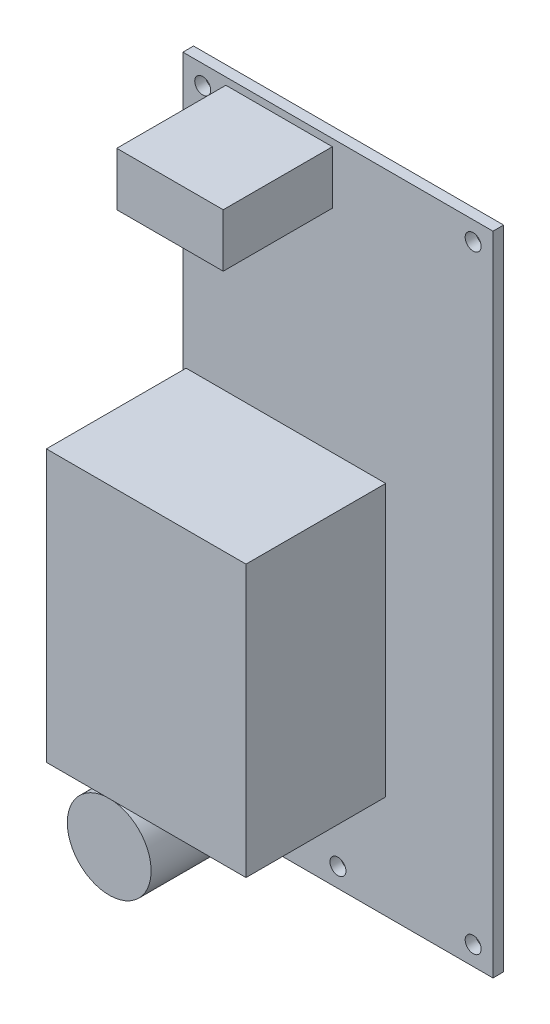
ISO-10303-21;
HEADER;
FILE_DESCRIPTION(('STEP AP214'),'2;1');
FILE_NAME('part.step','',(''),(''),'','','');
FILE_SCHEMA(('AUTOMOTIVE_DESIGN { 1 0 10303 214 1 1 1 1 }'));
ENDSEC;
DATA;
#1=APPLICATION_CONTEXT('core data for automotive mechanical design processes');
#2=APPLICATION_PROTOCOL_DEFINITION('international standard','automotive_design',2000,#1);
#3=PRODUCT_CONTEXT('',#1,'mechanical');
#4=PRODUCT('Part','Part','',(#3));
#5=PRODUCT_RELATED_PRODUCT_CATEGORY('part','',(#4));
#6=PRODUCT_DEFINITION_FORMATION('','',#4);
#7=PRODUCT_DEFINITION_CONTEXT('part definition',#1,'design');
#8=PRODUCT_DEFINITION('design','',#6,#7);
#9=PRODUCT_DEFINITION_SHAPE('','',#8);
#10=(LENGTH_UNIT() NAMED_UNIT(*) SI_UNIT(.MILLI.,.METRE.));
#11=(NAMED_UNIT(*) PLANE_ANGLE_UNIT() SI_UNIT($,.RADIAN.));
#12=(NAMED_UNIT(*) SI_UNIT($,.STERADIAN.) SOLID_ANGLE_UNIT());
#13=UNCERTAINTY_MEASURE_WITH_UNIT(LENGTH_MEASURE(1.E-05),#10,'distance_accuracy_value','');
#14=(GEOMETRIC_REPRESENTATION_CONTEXT(3) GLOBAL_UNCERTAINTY_ASSIGNED_CONTEXT((#13)) GLOBAL_UNIT_ASSIGNED_CONTEXT((#10,
#11,#12)) REPRESENTATION_CONTEXT('',''));
#15=CARTESIAN_POINT('',(0.,0.,0.));
#16=DIRECTION('',(0.,0.,1.));
#17=DIRECTION('',(1.,0.,0.));
#18=AXIS2_PLACEMENT_3D('',#15,#16,#17);
#19=CARTESIAN_POINT('',(466.15195568,440.71997454,-0.8));
#20=DIRECTION('',(0.,0.,1.));
#21=DIRECTION('',(1.,0.,0.));
#22=AXIS2_PLACEMENT_3D('',#19,#20,#21);
#23=CYLINDRICAL_SURFACE('',#22,0.600798900000032);
#24=CARTESIAN_POINT('',(466.15195568,440.71997454,0.));
#25=DIRECTION('',(0.,0.,-1.));
#26=DIRECTION('',(1.,0.,0.));
#27=AXIS2_PLACEMENT_3D('',#24,#25,#26);
#28=CIRCLE('',#27,0.600798900000032);
#29=CARTESIAN_POINT('',(466.75275458,440.71997454,0.));
#30=VERTEX_POINT('',#29);
#31=EDGE_CURVE('E180',#30,#30,#28,.T.);
#32=ORIENTED_EDGE('',*,*,#31,.F.);
#33=EDGE_LOOP('',(#32));
#34=FACE_BOUND('',#33,.T.);
#35=CARTESIAN_POINT('',(466.15195568,440.71997454,-0.8));
#36=DIRECTION('',(0.,0.,1.));
#37=DIRECTION('',(1.,0.,0.));
#38=AXIS2_PLACEMENT_3D('',#35,#36,#37);
#39=CIRCLE('',#38,0.600798900000032);
#40=CARTESIAN_POINT('',(466.75275458,440.71997454,-0.8));
#41=VERTEX_POINT('',#40);
#42=EDGE_CURVE('E195',#41,#41,#39,.T.);
#43=ORIENTED_EDGE('',*,*,#42,.F.);
#44=EDGE_LOOP('',(#43));
#45=FACE_BOUND('',#44,.T.);
#46=ADVANCED_FACE('F15',(#34,#45),#23,.F.);
#47=CARTESIAN_POINT('',(476.31195568,440.71997454,-0.8));
#48=DIRECTION('',(0.,0.,1.));
#49=DIRECTION('',(1.,0.,0.));
#50=AXIS2_PLACEMENT_3D('',#47,#48,#49);
#51=CYLINDRICAL_SURFACE('',#50,0.600798899999977);
#52=CARTESIAN_POINT('',(476.31195568,440.71997454,0.));
#53=DIRECTION('',(0.,0.,-1.));
#54=DIRECTION('',(1.,0.,0.));
#55=AXIS2_PLACEMENT_3D('',#52,#53,#54);
#56=CIRCLE('',#55,0.600798899999977);
#57=CARTESIAN_POINT('',(476.91275458,440.71997454,0.));
#58=VERTEX_POINT('',#57);
#59=EDGE_CURVE('E186',#58,#58,#56,.T.);
#60=ORIENTED_EDGE('',*,*,#59,.F.);
#61=EDGE_LOOP('',(#60));
#62=FACE_BOUND('',#61,.T.);
#63=CARTESIAN_POINT('',(476.31195568,440.71997454,-0.8));
#64=DIRECTION('',(0.,0.,1.));
#65=DIRECTION('',(1.,0.,0.));
#66=AXIS2_PLACEMENT_3D('',#63,#64,#65);
#67=CIRCLE('',#66,0.600798899999977);
#68=CARTESIAN_POINT('',(476.91275458,440.71997454,-0.8));
#69=VERTEX_POINT('',#68);
#70=EDGE_CURVE('E196',#69,#69,#67,.T.);
#71=ORIENTED_EDGE('',*,*,#70,.F.);
#72=EDGE_LOOP('',(#71));
#73=FACE_BOUND('',#72,.T.);
#74=ADVANCED_FACE('F270',(#62,#73),#51,.F.);
#75=CARTESIAN_POINT('',(476.31195568,486.43997454,-0.8));
#76=DIRECTION('',(0.,0.,1.));
#77=DIRECTION('',(1.,0.,0.));
#78=AXIS2_PLACEMENT_3D('',#75,#76,#77);
#79=CYLINDRICAL_SURFACE('',#78,0.600798899999977);
#80=CARTESIAN_POINT('',(476.31195568,486.43997454,0.));
#81=DIRECTION('',(0.,0.,-1.));
#82=DIRECTION('',(1.,0.,0.));
#83=AXIS2_PLACEMENT_3D('',#80,#81,#82);
#84=CIRCLE('',#83,0.600798899999977);
#85=CARTESIAN_POINT('',(476.91275458,486.43997454,0.));
#86=VERTEX_POINT('',#85);
#87=EDGE_CURVE('E191',#86,#86,#84,.T.);
#88=ORIENTED_EDGE('',*,*,#87,.F.);
#89=EDGE_LOOP('',(#88));
#90=FACE_BOUND('',#89,.T.);
#91=CARTESIAN_POINT('',(476.31195568,486.43997454,-0.8));
#92=DIRECTION('',(0.,0.,1.));
#93=DIRECTION('',(1.,0.,0.));
#94=AXIS2_PLACEMENT_3D('',#91,#92,#93);
#95=CIRCLE('',#94,0.600798899999977);
#96=CARTESIAN_POINT('',(476.91275458,486.43997454,-0.8));
#97=VERTEX_POINT('',#96);
#98=EDGE_CURVE('E198',#97,#97,#95,.T.);
#99=ORIENTED_EDGE('',*,*,#98,.F.);
#100=EDGE_LOOP('',(#99));
#101=FACE_BOUND('',#100,.T.);
#102=ADVANCED_FACE('F278',(#90,#101),#79,.F.);
#103=CARTESIAN_POINT('',(455.99195568,486.43997454,-0.8));
#104=DIRECTION('',(0.,0.,1.));
#105=DIRECTION('',(1.,0.,0.));
#106=AXIS2_PLACEMENT_3D('',#103,#104,#105);
#107=CYLINDRICAL_SURFACE('',#106,0.600798899999977);
#108=CARTESIAN_POINT('',(455.99195568,486.43997454,0.));
#109=DIRECTION('',(0.,0.,-1.));
#110=DIRECTION('',(1.,0.,0.));
#111=AXIS2_PLACEMENT_3D('',#108,#109,#110);
#112=CIRCLE('',#111,0.600798899999977);
#113=CARTESIAN_POINT('',(456.59275458,486.43997454,0.));
#114=VERTEX_POINT('',#113);
#115=EDGE_CURVE('E205',#114,#114,#112,.T.);
#116=ORIENTED_EDGE('',*,*,#115,.F.);
#117=EDGE_LOOP('',(#116));
#118=FACE_BOUND('',#117,.T.);
#119=CARTESIAN_POINT('',(455.99195568,486.43997454,-0.8));
#120=DIRECTION('',(0.,0.,1.));
#121=DIRECTION('',(1.,0.,0.));
#122=AXIS2_PLACEMENT_3D('',#119,#120,#121);
#123=CIRCLE('',#122,0.600798899999977);
#124=CARTESIAN_POINT('',(456.59275458,486.43997454,-0.8));
#125=VERTEX_POINT('',#124);
#126=EDGE_CURVE('E202',#125,#125,#123,.T.);
#127=ORIENTED_EDGE('',*,*,#126,.F.);
#128=EDGE_LOOP('',(#127));
#129=FACE_BOUND('',#128,.T.);
#130=ADVANCED_FACE('F285',(#118,#129),#107,.F.);
#131=CARTESIAN_POINT('',(458.4659614,442.9019844,9.5));
#132=DIRECTION('',(0.,0.,-1.));
#133=DIRECTION('',(-1.,0.,0.));
#134=AXIS2_PLACEMENT_3D('',#131,#132,#133);
#135=CYLINDRICAL_SURFACE('',#134,3.15000640000002);
#136=CARTESIAN_POINT('',(458.4659614,442.9019844,0.));
#137=DIRECTION('',(0.,0.,1.));
#138=DIRECTION('',(-1.,0.,0.));
#139=AXIS2_PLACEMENT_3D('',#136,#137,#138);
#140=CIRCLE('',#139,3.15000640000002);
#141=CARTESIAN_POINT('',(455.315955,442.9019844,0.));
#142=VERTEX_POINT('',#141);
#143=EDGE_CURVE('E25',#142,#142,#140,.T.);
#144=ORIENTED_EDGE('',*,*,#143,.T.);
#145=EDGE_LOOP('',(#144));
#146=FACE_BOUND('',#145,.T.);
#147=CARTESIAN_POINT('',(458.4659614,442.9019844,9.5));
#148=DIRECTION('',(0.,0.,-1.));
#149=DIRECTION('',(-1.,0.,0.));
#150=AXIS2_PLACEMENT_3D('',#147,#148,#149);
#151=CIRCLE('',#150,3.15000640000002);
#152=CARTESIAN_POINT('',(455.315955,442.9019844,9.5));
#153=VERTEX_POINT('',#152);
#154=EDGE_CURVE('E10',#153,#153,#151,.T.);
#155=ORIENTED_EDGE('',*,*,#154,.T.);
#156=EDGE_LOOP('',(#155));
#157=FACE_BOUND('',#156,.T.);
#158=ADVANCED_FACE('F289',(#146,#157),#135,.T.);
#159=CARTESIAN_POINT('',(454.4019614,439.2321742,-0.8));
#160=DIRECTION('',(0.,0.,-1.));
#161=DIRECTION('',(-1.,0.,0.));
#162=AXIS2_PLACEMENT_3D('',#159,#160,#161);
#163=PLANE('',#162);
#164=DIRECTION('',(1.,0.,0.));
#165=VECTOR('',#164,1.);
#166=CARTESIAN_POINT('',(454.4019614,487.8799742,-0.8));
#167=LINE('',#166,#165);
#168=CARTESIAN_POINT('',(454.5019614,487.8799742,-0.800000000000002));
#169=VERTEX_POINT('',#168);
#170=CARTESIAN_POINT('',(477.80196266,487.8799742,-0.800000000000002));
#171=VERTEX_POINT('',#170);
#172=EDGE_CURVE('E214',#169,#171,#167,.T.);
#173=ORIENTED_EDGE('',*,*,#172,.T.);
#174=DIRECTION('',(0.,-1.,0.));
#175=VECTOR('',#174,1.);
#176=CARTESIAN_POINT('',(477.80196266,439.2321742,-0.8));
#177=LINE('',#176,#175);
#178=CARTESIAN_POINT('',(477.80196266,439.2821742,-0.800000000000002));
#179=VERTEX_POINT('',#178);
#180=EDGE_CURVE('E34',#171,#179,#177,.T.);
#181=ORIENTED_EDGE('',*,*,#180,.T.);
#182=DIRECTION('',(-1.,0.,0.));
#183=VECTOR('',#182,1.);
#184=CARTESIAN_POINT('',(454.4019614,439.2821742,-0.8));
#185=LINE('',#184,#183);
#186=CARTESIAN_POINT('',(454.5019614,439.2821742,-0.800000000000002));
#187=VERTEX_POINT('',#186);
#188=EDGE_CURVE('E217',#179,#187,#185,.T.);
#189=ORIENTED_EDGE('',*,*,#188,.T.);
#190=DIRECTION('',(0.,1.,0.));
#191=VECTOR('',#190,1.);
#192=CARTESIAN_POINT('',(454.5019614,439.2321742,-0.8));
#193=LINE('',#192,#191);
#194=EDGE_CURVE('E220',#187,#169,#193,.T.);
#195=ORIENTED_EDGE('',*,*,#194,.T.);
#196=EDGE_LOOP('',(#173,#181,#189,#195));
#197=FACE_BOUND('',#196,.T.);
#198=ORIENTED_EDGE('',*,*,#42,.T.);
#199=EDGE_LOOP('',(#198));
#200=FACE_BOUND('',#199,.T.);
#201=ORIENTED_EDGE('',*,*,#70,.T.);
#202=EDGE_LOOP('',(#201));
#203=FACE_BOUND('',#202,.T.);
#204=ORIENTED_EDGE('',*,*,#98,.T.);
#205=EDGE_LOOP('',(#204));
#206=FACE_BOUND('',#205,.T.);
#207=ORIENTED_EDGE('',*,*,#126,.T.);
#208=EDGE_LOOP('',(#207));
#209=FACE_BOUND('',#208,.T.);
#210=ADVANCED_FACE('F253',(#197,#200,#203,#206,#209),#163,.T.);
#211=CARTESIAN_POINT('',(477.80196266,487.8799742,48.5978257213221));
#212=DIRECTION('',(1.,0.,0.));
#213=DIRECTION('',(0.,0.,-1.));
#214=AXIS2_PLACEMENT_3D('',#211,#212,#213);
#215=PLANE('',#214);
#216=ORIENTED_EDGE('',*,*,#180,.F.);
#217=DIRECTION('',(0.,0.,1.));
#218=VECTOR('',#217,1.);
#219=CARTESIAN_POINT('',(477.80196266,487.8799742,48.5978257213221));
#220=LINE('',#219,#218);
#221=CARTESIAN_POINT('',(477.80196266,487.8799742,0.));
#222=VERTEX_POINT('',#221);
#223=EDGE_CURVE('E208',#171,#222,#220,.T.);
#224=ORIENTED_EDGE('',*,*,#223,.T.);
#225=DIRECTION('',(0.,-1.,0.));
#226=VECTOR('',#225,1.);
#227=CARTESIAN_POINT('',(477.80196266,487.8799742,0.));
#228=LINE('',#227,#226);
#229=CARTESIAN_POINT('',(477.80196266,439.2821742,0.));
#230=VERTEX_POINT('',#229);
#231=EDGE_CURVE('E224',#222,#230,#228,.T.);
#232=ORIENTED_EDGE('',*,*,#231,.T.);
#233=DIRECTION('',(0.,0.,-1.));
#234=VECTOR('',#233,1.);
#235=CARTESIAN_POINT('',(477.80196266,439.2821742,48.5978257213221));
#236=LINE('',#235,#234);
#237=EDGE_CURVE('E227',#230,#179,#236,.T.);
#238=ORIENTED_EDGE('',*,*,#237,.T.);
#239=EDGE_LOOP('',(#216,#224,#232,#238));
#240=FACE_BOUND('',#239,.T.);
#241=ADVANCED_FACE('F256',(#240),#215,.T.);
#242=CARTESIAN_POINT('',(454.5519614,487.8799742,53.851520157782));
#243=DIRECTION('',(0.,1.,0.));
#244=DIRECTION('',(0.,0.,1.));
#245=AXIS2_PLACEMENT_3D('',#242,#243,#244);
#246=PLANE('',#245);
#247=ORIENTED_EDGE('',*,*,#172,.F.);
#248=DIRECTION('',(0.,0.,1.));
#249=VECTOR('',#248,1.);
#250=CARTESIAN_POINT('',(454.5019614,487.8799742,53.851520157782));
#251=LINE('',#250,#249);
#252=CARTESIAN_POINT('',(454.5019614,487.8799742,0.));
#253=VERTEX_POINT('',#252);
#254=EDGE_CURVE('E229',#169,#253,#251,.T.);
#255=ORIENTED_EDGE('',*,*,#254,.T.);
#256=DIRECTION('',(1.,0.,0.));
#257=VECTOR('',#256,1.);
#258=CARTESIAN_POINT('',(454.5519614,487.8799742,0.));
#259=LINE('',#258,#257);
#260=EDGE_CURVE('E232',#253,#222,#259,.T.);
#261=ORIENTED_EDGE('',*,*,#260,.T.);
#262=ORIENTED_EDGE('',*,*,#223,.F.);
#263=EDGE_LOOP('',(#247,#255,#261,#262));
#264=FACE_BOUND('',#263,.T.);
#265=ADVANCED_FACE('F258',(#264),#246,.T.);
#266=CARTESIAN_POINT('',(454.5019614,487.8799742,48.5978257213221));
#267=DIRECTION('',(-1.,0.,0.));
#268=DIRECTION('',(0.,0.,1.));
#269=AXIS2_PLACEMENT_3D('',#266,#267,#268);
#270=PLANE('',#269);
#271=ORIENTED_EDGE('',*,*,#194,.F.);
#272=DIRECTION('',(0.,0.,1.));
#273=VECTOR('',#272,1.);
#274=CARTESIAN_POINT('',(454.5019614,439.2821742,48.5978257213221));
#275=LINE('',#274,#273);
#276=CARTESIAN_POINT('',(454.5019614,439.2821742,0.));
#277=VERTEX_POINT('',#276);
#278=EDGE_CURVE('E235',#187,#277,#275,.T.);
#279=ORIENTED_EDGE('',*,*,#278,.T.);
#280=DIRECTION('',(0.,1.,0.));
#281=VECTOR('',#280,1.);
#282=CARTESIAN_POINT('',(454.5019614,487.8799742,0.));
#283=LINE('',#282,#281);
#284=EDGE_CURVE('E238',#277,#253,#283,.T.);
#285=ORIENTED_EDGE('',*,*,#284,.T.);
#286=ORIENTED_EDGE('',*,*,#254,.F.);
#287=EDGE_LOOP('',(#271,#279,#285,#286));
#288=FACE_BOUND('',#287,.T.);
#289=ADVANCED_FACE('F250',(#288),#270,.T.);
#290=CARTESIAN_POINT('',(477.75196266,439.2821742,53.851520157782));
#291=DIRECTION('',(0.,-1.,0.));
#292=DIRECTION('',(0.,0.,-1.));
#293=AXIS2_PLACEMENT_3D('',#290,#291,#292);
#294=PLANE('',#293);
#295=ORIENTED_EDGE('',*,*,#188,.F.);
#296=ORIENTED_EDGE('',*,*,#237,.F.);
#297=DIRECTION('',(-1.,0.,0.));
#298=VECTOR('',#297,1.);
#299=CARTESIAN_POINT('',(477.75196266,439.2821742,0.));
#300=LINE('',#299,#298);
#301=EDGE_CURVE('E210',#230,#277,#300,.T.);
#302=ORIENTED_EDGE('',*,*,#301,.T.);
#303=ORIENTED_EDGE('',*,*,#278,.F.);
#304=EDGE_LOOP('',(#295,#296,#302,#303));
#305=FACE_BOUND('',#304,.T.);
#306=ADVANCED_FACE('F244',(#305),#294,.T.);
#307=CARTESIAN_POINT('',(454.4019614,439.2321742,0.));
#308=DIRECTION('',(0.,0.,-1.));
#309=DIRECTION('',(-1.,0.,0.));
#310=AXIS2_PLACEMENT_3D('',#307,#308,#309);
#311=PLANE('',#310);
#312=ORIENTED_EDGE('',*,*,#284,.F.);
#313=ORIENTED_EDGE('',*,*,#301,.F.);
#314=ORIENTED_EDGE('',*,*,#231,.F.);
#315=ORIENTED_EDGE('',*,*,#260,.F.);
#316=EDGE_LOOP('',(#312,#313,#314,#315));
#317=FACE_BOUND('',#316,.T.);
#318=ORIENTED_EDGE('',*,*,#115,.T.);
#319=EDGE_LOOP('',(#318));
#320=FACE_BOUND('',#319,.T.);
#321=ORIENTED_EDGE('',*,*,#87,.T.);
#322=EDGE_LOOP('',(#321));
#323=FACE_BOUND('',#322,.T.);
#324=ORIENTED_EDGE('',*,*,#59,.T.);
#325=EDGE_LOOP('',(#324));
#326=FACE_BOUND('',#325,.T.);
#327=ORIENTED_EDGE('',*,*,#31,.T.);
#328=EDGE_LOOP('',(#327));
#329=FACE_BOUND('',#328,.T.);
#330=ORIENTED_EDGE('',*,*,#143,.F.);
#331=EDGE_LOOP('',(#330));
#332=FACE_BOUND('',#331,.T.);
#333=DIRECTION('',(-1.,0.,0.));
#334=VECTOR('',#333,1.);
#335=CARTESIAN_POINT('',(454.4019614,487.3399702,0.));
#336=LINE('',#335,#334);
#337=CARTESIAN_POINT('',(465.7319616,487.3399702,0.));
#338=VERTEX_POINT('',#337);
#339=CARTESIAN_POINT('',(457.7319776,487.3399702,0.));
#340=VERTEX_POINT('',#339);
#341=EDGE_CURVE('E159',#338,#340,#336,.T.);
#342=ORIENTED_EDGE('',*,*,#341,.F.);
#343=DIRECTION('',(0.,1.,0.));
#344=VECTOR('',#343,1.);
#345=CARTESIAN_POINT('',(465.7319616,439.2321742,0.));
#346=LINE('',#345,#344);
#347=CARTESIAN_POINT('',(465.7319616,483.3399782,0.));
#348=VERTEX_POINT('',#347);
#349=EDGE_CURVE('E165',#348,#338,#346,.T.);
#350=ORIENTED_EDGE('',*,*,#349,.F.);
#351=DIRECTION('',(1.,0.,0.));
#352=VECTOR('',#351,1.);
#353=CARTESIAN_POINT('',(454.4019614,483.3399782,0.));
#354=LINE('',#353,#352);
#355=CARTESIAN_POINT('',(457.7319776,483.3399782,0.));
#356=VERTEX_POINT('',#355);
#357=EDGE_CURVE('E148',#356,#348,#354,.T.);
#358=ORIENTED_EDGE('',*,*,#357,.F.);
#359=DIRECTION('',(0.,-1.,0.));
#360=VECTOR('',#359,1.);
#361=CARTESIAN_POINT('',(457.7319776,439.2321742,0.));
#362=LINE('',#361,#360);
#363=EDGE_CURVE('E158',#340,#356,#362,.T.);
#364=ORIENTED_EDGE('',*,*,#363,.F.);
#365=EDGE_LOOP('',(#342,#350,#358,#364));
#366=FACE_BOUND('',#365,.T.);
#367=DIRECTION('',(1.,0.,0.));
#368=VECTOR('',#367,1.);
#369=CARTESIAN_POINT('',(454.4019614,447.0359614,0.));
#370=LINE('',#369,#368);
#371=CARTESIAN_POINT('',(454.7429818,447.0359614,0.));
#372=VERTEX_POINT('',#371);
#373=CARTESIAN_POINT('',(469.7429772,447.0359614,0.));
#374=VERTEX_POINT('',#373);
#375=EDGE_CURVE('E137',#372,#374,#370,.T.);
#376=ORIENTED_EDGE('',*,*,#375,.F.);
#377=DIRECTION('',(0.,-1.,0.));
#378=VECTOR('',#377,1.);
#379=CARTESIAN_POINT('',(454.7429818,439.2321742,0.));
#380=LINE('',#379,#378);
#381=CARTESIAN_POINT('',(454.7429818,467.4359714,0.));
#382=VERTEX_POINT('',#381);
#383=EDGE_CURVE('E123',#382,#372,#380,.T.);
#384=ORIENTED_EDGE('',*,*,#383,.F.);
#385=DIRECTION('',(-1.,0.,0.));
#386=VECTOR('',#385,1.);
#387=CARTESIAN_POINT('',(454.4019614,467.4359714,0.));
#388=LINE('',#387,#386);
#389=CARTESIAN_POINT('',(469.7429772,467.4359714,0.));
#390=VERTEX_POINT('',#389);
#391=EDGE_CURVE('E121',#390,#382,#388,.T.);
#392=ORIENTED_EDGE('',*,*,#391,.F.);
#393=DIRECTION('',(0.,1.,0.));
#394=VECTOR('',#393,1.);
#395=CARTESIAN_POINT('',(469.7429772,439.2321742,0.));
#396=LINE('',#395,#394);
#397=EDGE_CURVE('E136',#374,#390,#396,.T.);
#398=ORIENTED_EDGE('',*,*,#397,.F.);
#399=EDGE_LOOP('',(#376,#384,#392,#398));
#400=FACE_BOUND('',#399,.T.);
#401=ADVANCED_FACE('F246',(#317,#320,#323,#326,#329,#332,#366,#400),#311,.F.);
#402=CARTESIAN_POINT('',(457.7319776,487.3399702,8.2));
#403=DIRECTION('',(1.,0.,0.));
#404=DIRECTION('',(0.,0.,-1.));
#405=AXIS2_PLACEMENT_3D('',#402,#403,#404);
#406=PLANE('',#405);
#407=DIRECTION('',(0.,0.,-1.));
#408=VECTOR('',#407,1.);
#409=CARTESIAN_POINT('',(457.7319776,483.3399782,8.2));
#410=LINE('',#409,#408);
#411=CARTESIAN_POINT('',(457.7319776,483.3399782,8.2));
#412=VERTEX_POINT('',#411);
#413=EDGE_CURVE('E149',#412,#356,#410,.T.);
#414=ORIENTED_EDGE('',*,*,#413,.F.);
#415=DIRECTION('',(0.,-1.,0.));
#416=VECTOR('',#415,1.);
#417=CARTESIAN_POINT('',(457.7319776,487.3399702,8.2));
#418=LINE('',#417,#416);
#419=CARTESIAN_POINT('',(457.7319776,487.3399702,8.2));
#420=VERTEX_POINT('',#419);
#421=EDGE_CURVE('E130',#420,#412,#418,.T.);
#422=ORIENTED_EDGE('',*,*,#421,.F.);
#423=DIRECTION('',(0.,0.,1.));
#424=VECTOR('',#423,1.);
#425=CARTESIAN_POINT('',(457.7319776,487.3399702,8.2));
#426=LINE('',#425,#424);
#427=EDGE_CURVE('E155',#340,#420,#426,.T.);
#428=ORIENTED_EDGE('',*,*,#427,.F.);
#429=ORIENTED_EDGE('',*,*,#363,.T.);
#430=EDGE_LOOP('',(#414,#422,#428,#429));
#431=FACE_BOUND('',#430,.T.);
#432=ADVANCED_FACE('F340',(#431),#406,.F.);
#433=CARTESIAN_POINT('',(457.7319776,487.3399702,8.2));
#434=DIRECTION('',(0.,-1.,0.));
#435=DIRECTION('',(0.,0.,-1.));
#436=AXIS2_PLACEMENT_3D('',#433,#434,#435);
#437=PLANE('',#436);
#438=ORIENTED_EDGE('',*,*,#427,.T.);
#439=DIRECTION('',(-1.,0.,0.));
#440=VECTOR('',#439,1.);
#441=CARTESIAN_POINT('',(457.7319776,487.3399702,8.2));
#442=LINE('',#441,#440);
#443=CARTESIAN_POINT('',(465.7319616,487.3399702,8.2));
#444=VERTEX_POINT('',#443);
#445=EDGE_CURVE('E154',#444,#420,#442,.T.);
#446=ORIENTED_EDGE('',*,*,#445,.F.);
#447=DIRECTION('',(0.,0.,1.));
#448=VECTOR('',#447,1.);
#449=CARTESIAN_POINT('',(465.7319616,487.3399702,8.2));
#450=LINE('',#449,#448);
#451=EDGE_CURVE('E162',#338,#444,#450,.T.);
#452=ORIENTED_EDGE('',*,*,#451,.F.);
#453=ORIENTED_EDGE('',*,*,#341,.T.);
#454=EDGE_LOOP('',(#438,#446,#452,#453));
#455=FACE_BOUND('',#454,.T.);
#456=ADVANCED_FACE('F350',(#455),#437,.F.);
#457=CARTESIAN_POINT('',(465.7319616,487.3399702,8.2));
#458=DIRECTION('',(-1.,0.,0.));
#459=DIRECTION('',(0.,0.,1.));
#460=AXIS2_PLACEMENT_3D('',#457,#458,#459);
#461=PLANE('',#460);
#462=ORIENTED_EDGE('',*,*,#451,.T.);
#463=DIRECTION('',(0.,1.,0.));
#464=VECTOR('',#463,1.);
#465=CARTESIAN_POINT('',(465.7319616,487.3399702,8.2));
#466=LINE('',#465,#464);
#467=CARTESIAN_POINT('',(465.7319616,483.3399782,8.2));
#468=VERTEX_POINT('',#467);
#469=EDGE_CURVE('E145',#468,#444,#466,.T.);
#470=ORIENTED_EDGE('',*,*,#469,.F.);
#471=DIRECTION('',(0.,0.,1.));
#472=VECTOR('',#471,1.);
#473=CARTESIAN_POINT('',(465.7319616,483.3399782,8.2));
#474=LINE('',#473,#472);
#475=EDGE_CURVE('E152',#348,#468,#474,.T.);
#476=ORIENTED_EDGE('',*,*,#475,.F.);
#477=ORIENTED_EDGE('',*,*,#349,.T.);
#478=EDGE_LOOP('',(#462,#470,#476,#477));
#479=FACE_BOUND('',#478,.T.);
#480=ADVANCED_FACE('F360',(#479),#461,.F.);
#481=CARTESIAN_POINT('',(457.7319776,483.3399782,8.2));
#482=DIRECTION('',(0.,1.,0.));
#483=DIRECTION('',(0.,0.,1.));
#484=AXIS2_PLACEMENT_3D('',#481,#482,#483);
#485=PLANE('',#484);
#486=ORIENTED_EDGE('',*,*,#475,.T.);
#487=DIRECTION('',(1.,0.,0.));
#488=VECTOR('',#487,1.);
#489=CARTESIAN_POINT('',(457.7319776,483.3399782,8.2));
#490=LINE('',#489,#488);
#491=EDGE_CURVE('E127',#412,#468,#490,.T.);
#492=ORIENTED_EDGE('',*,*,#491,.F.);
#493=ORIENTED_EDGE('',*,*,#413,.T.);
#494=ORIENTED_EDGE('',*,*,#357,.T.);
#495=EDGE_LOOP('',(#486,#492,#493,#494));
#496=FACE_BOUND('',#495,.T.);
#497=ADVANCED_FACE('F371',(#496),#485,.F.);
#498=CARTESIAN_POINT('',(469.7429772,467.4359714,10.5));
#499=DIRECTION('',(-1.,0.,0.));
#500=DIRECTION('',(0.,0.,1.));
#501=AXIS2_PLACEMENT_3D('',#498,#499,#500);
#502=PLANE('',#501);
#503=DIRECTION('',(0.,0.,-1.));
#504=VECTOR('',#503,1.);
#505=CARTESIAN_POINT('',(469.7429772,467.4359714,10.5));
#506=LINE('',#505,#504);
#507=CARTESIAN_POINT('',(469.7429772,467.4359714,10.5));
#508=VERTEX_POINT('',#507);
#509=EDGE_CURVE('E124',#508,#390,#506,.T.);
#510=ORIENTED_EDGE('',*,*,#509,.F.);
#511=DIRECTION('',(0.,1.,0.));
#512=VECTOR('',#511,1.);
#513=CARTESIAN_POINT('',(469.7429772,467.4359714,10.5));
#514=LINE('',#513,#512);
#515=CARTESIAN_POINT('',(469.7429772,447.0359614,10.5));
#516=VERTEX_POINT('',#515);
#517=EDGE_CURVE('E125',#516,#508,#514,.T.);
#518=ORIENTED_EDGE('',*,*,#517,.F.);
#519=DIRECTION('',(0.,0.,1.));
#520=VECTOR('',#519,1.);
#521=CARTESIAN_POINT('',(469.7429772,447.0359614,10.5));
#522=LINE('',#521,#520);
#523=EDGE_CURVE('E134',#374,#516,#522,.T.);
#524=ORIENTED_EDGE('',*,*,#523,.F.);
#525=ORIENTED_EDGE('',*,*,#397,.T.);
#526=EDGE_LOOP('',(#510,#518,#524,#525));
#527=FACE_BOUND('',#526,.T.);
#528=ADVANCED_FACE('F381',(#527),#502,.F.);
#529=CARTESIAN_POINT('',(454.7429818,447.0359614,10.5));
#530=DIRECTION('',(0.,1.,0.));
#531=DIRECTION('',(0.,0.,1.));
#532=AXIS2_PLACEMENT_3D('',#529,#530,#531);
#533=PLANE('',#532);
#534=ORIENTED_EDGE('',*,*,#523,.T.);
#535=DIRECTION('',(1.,0.,0.));
#536=VECTOR('',#535,1.);
#537=CARTESIAN_POINT('',(454.7429818,447.0359614,10.5));
#538=LINE('',#537,#536);
#539=CARTESIAN_POINT('',(454.7429818,447.0359614,10.5));
#540=VERTEX_POINT('',#539);
#541=EDGE_CURVE('E103',#540,#516,#538,.T.);
#542=ORIENTED_EDGE('',*,*,#541,.F.);
#543=DIRECTION('',(0.,0.,1.));
#544=VECTOR('',#543,1.);
#545=CARTESIAN_POINT('',(454.7429818,447.0359614,10.5));
#546=LINE('',#545,#544);
#547=EDGE_CURVE('E113',#372,#540,#546,.T.);
#548=ORIENTED_EDGE('',*,*,#547,.F.);
#549=ORIENTED_EDGE('',*,*,#375,.T.);
#550=EDGE_LOOP('',(#534,#542,#548,#549));
#551=FACE_BOUND('',#550,.T.);
#552=ADVANCED_FACE('F391',(#551),#533,.F.);
#553=CARTESIAN_POINT('',(454.7429818,467.4359714,10.5));
#554=DIRECTION('',(1.,0.,0.));
#555=DIRECTION('',(0.,0.,-1.));
#556=AXIS2_PLACEMENT_3D('',#553,#554,#555);
#557=PLANE('',#556);
#558=ORIENTED_EDGE('',*,*,#547,.T.);
#559=DIRECTION('',(0.,-1.,0.));
#560=VECTOR('',#559,1.);
#561=CARTESIAN_POINT('',(454.7429818,467.4359714,10.5));
#562=LINE('',#561,#560);
#563=CARTESIAN_POINT('',(454.7429818,467.4359714,10.5));
#564=VERTEX_POINT('',#563);
#565=EDGE_CURVE('E109',#564,#540,#562,.T.);
#566=ORIENTED_EDGE('',*,*,#565,.F.);
#567=DIRECTION('',(0.,0.,1.));
#568=VECTOR('',#567,1.);
#569=CARTESIAN_POINT('',(454.7429818,467.4359714,10.5));
#570=LINE('',#569,#568);
#571=EDGE_CURVE('E112',#382,#564,#570,.T.);
#572=ORIENTED_EDGE('',*,*,#571,.F.);
#573=ORIENTED_EDGE('',*,*,#383,.T.);
#574=EDGE_LOOP('',(#558,#566,#572,#573));
#575=FACE_BOUND('',#574,.T.);
#576=ADVANCED_FACE('F111',(#575),#557,.F.);
#577=CARTESIAN_POINT('',(454.7429818,467.4359714,10.5));
#578=DIRECTION('',(0.,-1.,0.));
#579=DIRECTION('',(0.,0.,-1.));
#580=AXIS2_PLACEMENT_3D('',#577,#578,#579);
#581=PLANE('',#580);
#582=ORIENTED_EDGE('',*,*,#571,.T.);
#583=DIRECTION('',(-1.,0.,0.));
#584=VECTOR('',#583,1.);
#585=CARTESIAN_POINT('',(454.7429818,467.4359714,10.5));
#586=LINE('',#585,#584);
#587=EDGE_CURVE('E19',#508,#564,#586,.T.);
#588=ORIENTED_EDGE('',*,*,#587,.F.);
#589=ORIENTED_EDGE('',*,*,#509,.T.);
#590=ORIENTED_EDGE('',*,*,#391,.T.);
#591=EDGE_LOOP('',(#582,#588,#589,#590));
#592=FACE_BOUND('',#591,.T.);
#593=ADVANCED_FACE('F119',(#592),#581,.F.);
#594=CARTESIAN_POINT('',(458.4659614,442.9019844,9.5));
#595=DIRECTION('',(0.,0.,1.));
#596=DIRECTION('',(1.,0.,0.));
#597=AXIS2_PLACEMENT_3D('',#594,#595,#596);
#598=PLANE('',#597);
#599=ORIENTED_EDGE('',*,*,#154,.F.);
#600=EDGE_LOOP('',(#599));
#601=FACE_BOUND('',#600,.T.);
#602=ADVANCED_FACE('F420',(#601),#598,.T.);
#603=CARTESIAN_POINT('',(457.7319776,483.3399782,8.2));
#604=DIRECTION('',(0.,0.,1.));
#605=DIRECTION('',(1.,0.,0.));
#606=AXIS2_PLACEMENT_3D('',#603,#604,#605);
#607=PLANE('',#606);
#608=ORIENTED_EDGE('',*,*,#469,.T.);
#609=ORIENTED_EDGE('',*,*,#445,.T.);
#610=ORIENTED_EDGE('',*,*,#421,.T.);
#611=ORIENTED_EDGE('',*,*,#491,.T.);
#612=EDGE_LOOP('',(#608,#609,#610,#611));
#613=FACE_BOUND('',#612,.T.);
#614=ADVANCED_FACE('F430',(#613),#607,.T.);
#615=CARTESIAN_POINT('',(454.7429818,447.0359614,10.5));
#616=DIRECTION('',(0.,0.,1.));
#617=DIRECTION('',(1.,0.,0.));
#618=AXIS2_PLACEMENT_3D('',#615,#616,#617);
#619=PLANE('',#618);
#620=ORIENTED_EDGE('',*,*,#517,.T.);
#621=ORIENTED_EDGE('',*,*,#587,.T.);
#622=ORIENTED_EDGE('',*,*,#565,.T.);
#623=ORIENTED_EDGE('',*,*,#541,.T.);
#624=EDGE_LOOP('',(#620,#621,#622,#623));
#625=FACE_BOUND('',#624,.T.);
#626=ADVANCED_FACE('F17',(#625),#619,.T.);
#627=CLOSED_SHELL('',(#46,#74,#102,#130,#158,#210,#241,#265,#289,#306,#401,#432,#456,#480,#497,
#528,#552,#576,#593,#602,#614,#626));
#628=MANIFOLD_SOLID_BREP('B1',#627);
#629=ADVANCED_BREP_SHAPE_REPRESENTATION('',(#18,#628),#14);
#630=SHAPE_DEFINITION_REPRESENTATION(#9,#629);
ENDSEC;
END-ISO-10303-21;
